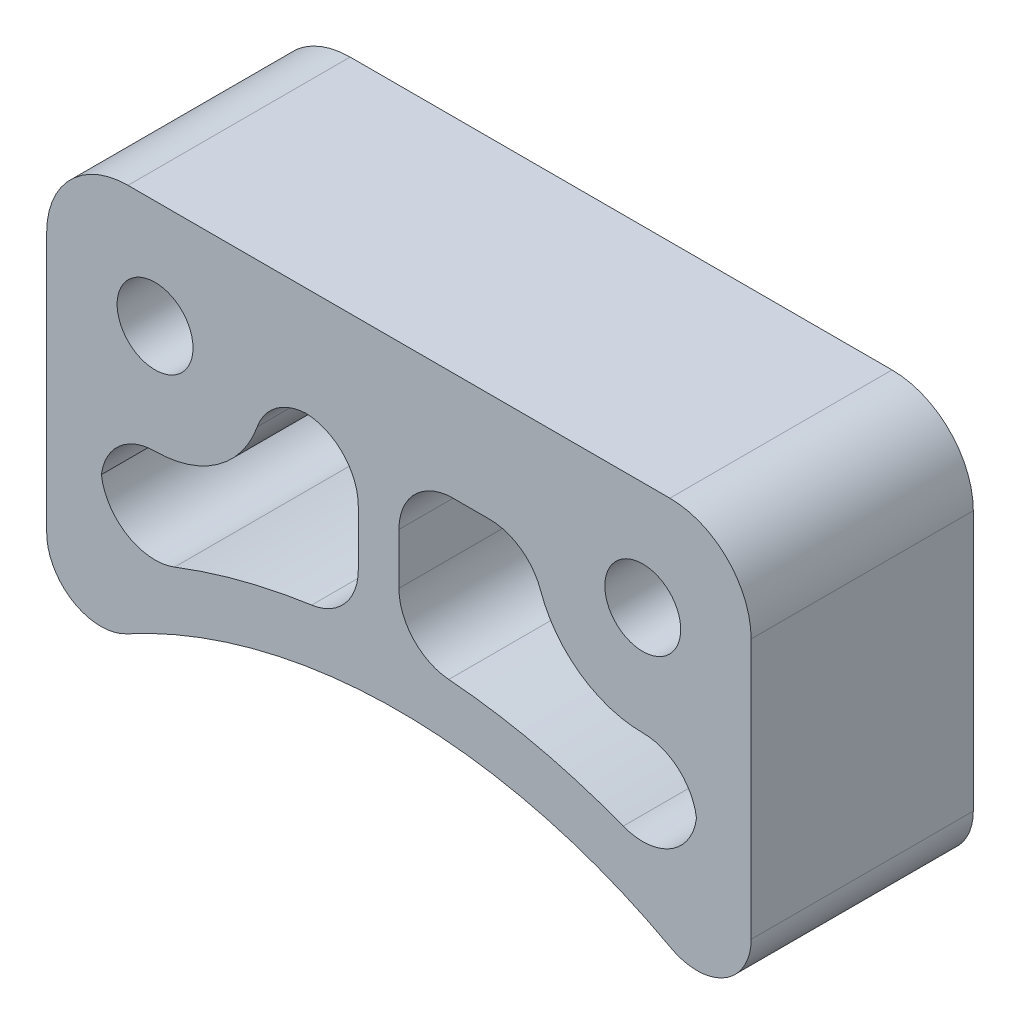
ISO-10303-21;
HEADER;
FILE_DESCRIPTION(('STEP AP214'),'2;1');
FILE_NAME('part.step','',(''),(''),'','','');
FILE_SCHEMA(('AUTOMOTIVE_DESIGN { 1 0 10303 214 1 1 1 1 }'));
ENDSEC;
DATA;
#1=APPLICATION_CONTEXT('core data for automotive mechanical design processes');
#2=APPLICATION_PROTOCOL_DEFINITION('international standard','automotive_design',2000,#1);
#3=PRODUCT_CONTEXT('',#1,'mechanical');
#4=PRODUCT('Part','Part','',(#3));
#5=PRODUCT_RELATED_PRODUCT_CATEGORY('part','',(#4));
#6=PRODUCT_DEFINITION_FORMATION('','',#4);
#7=PRODUCT_DEFINITION_CONTEXT('part definition',#1,'design');
#8=PRODUCT_DEFINITION('design','',#6,#7);
#9=PRODUCT_DEFINITION_SHAPE('','',#8);
#10=(LENGTH_UNIT() NAMED_UNIT(*) SI_UNIT(.MILLI.,.METRE.));
#11=(NAMED_UNIT(*) PLANE_ANGLE_UNIT() SI_UNIT($,.RADIAN.));
#12=(NAMED_UNIT(*) SI_UNIT($,.STERADIAN.) SOLID_ANGLE_UNIT());
#13=UNCERTAINTY_MEASURE_WITH_UNIT(LENGTH_MEASURE(1.E-05),#10,'distance_accuracy_value','');
#14=(GEOMETRIC_REPRESENTATION_CONTEXT(3) GLOBAL_UNCERTAINTY_ASSIGNED_CONTEXT((#13)) GLOBAL_UNIT_ASSIGNED_CONTEXT((#10,
#11,#12)) REPRESENTATION_CONTEXT('',''));
#15=CARTESIAN_POINT('',(0.,0.,0.));
#16=DIRECTION('',(0.,0.,1.));
#17=DIRECTION('',(1.,0.,0.));
#18=AXIS2_PLACEMENT_3D('',#15,#16,#17);
#19=CARTESIAN_POINT('',(1.07552855510562E-12,-28.8000000000008,-1.8));
#20=DIRECTION('',(0.,0.,1.));
#21=DIRECTION('',(1.,0.,0.));
#22=AXIS2_PLACEMENT_3D('',#19,#20,#21);
#23=CYLINDRICAL_SURFACE('',#22,22.9999999999993);
#24=CARTESIAN_POINT('',(1.07552855510562E-12,-28.8000000000008,0.));
#25=DIRECTION('',(0.,0.,1.));
#26=DIRECTION('',(1.,0.,0.));
#27=AXIS2_PLACEMENT_3D('',#24,#25,#26);
#28=CIRCLE('',#27,22.9999999999993);
#29=CARTESIAN_POINT('',(8.28000000000007,-7.34209702697041,0.));
#30=VERTEX_POINT('',#29);
#31=CARTESIAN_POINT('',(1.84000000000016,-5.8737181383475,0.));
#32=VERTEX_POINT('',#31);
#33=EDGE_CURVE('E275',#30,#32,#28,.T.);
#34=ORIENTED_EDGE('',*,*,#33,.T.);
#35=DIRECTION('',(0.,0.,1.));
#36=VECTOR('',#35,1.);
#37=CARTESIAN_POINT('',(1.84000000000016,-5.8737181383475,-1.8));
#38=LINE('',#37,#36);
#39=CARTESIAN_POINT('',(1.84000000000016,-5.8737181383475,8.2));
#40=VERTEX_POINT('',#39);
#41=EDGE_CURVE('E291',#32,#40,#38,.T.);
#42=ORIENTED_EDGE('',*,*,#41,.T.);
#43=CARTESIAN_POINT('',(1.07552855510562E-12,-28.8000000000008,8.2));
#44=DIRECTION('',(0.,0.,1.));
#45=DIRECTION('',(1.,0.,0.));
#46=AXIS2_PLACEMENT_3D('',#43,#44,#45);
#47=CIRCLE('',#46,22.9999999999993);
#48=CARTESIAN_POINT('',(8.28000000000007,-7.34209702697041,8.2));
#49=VERTEX_POINT('',#48);
#50=EDGE_CURVE('E382',#49,#40,#47,.T.);
#51=ORIENTED_EDGE('',*,*,#50,.F.);
#52=DIRECTION('',(0.,0.,1.));
#53=VECTOR('',#52,1.);
#54=CARTESIAN_POINT('',(8.28000000000007,-7.3420970269704,-1.8));
#55=LINE('',#54,#53);
#56=EDGE_CURVE('E289',#49,#30,#55,.F.);
#57=ORIENTED_EDGE('',*,*,#56,.T.);
#58=EDGE_LOOP('',(#34,#42,#51,#57));
#59=FACE_BOUND('',#58,.T.);
#60=ADVANCED_FACE('F39',(#59),#23,.T.);
#61=CARTESIAN_POINT('',(0.,0.,-1.8));
#62=DIRECTION('',(0.,-1.,0.));
#63=DIRECTION('',(0.,0.,-1.));
#64=AXIS2_PLACEMENT_3D('',#61,#62,#63);
#65=PLANE('',#64);
#66=DIRECTION('',(1.,0.,0.));
#67=VECTOR('',#66,1.);
#68=CARTESIAN_POINT('',(0.,0.,8.2));
#69=LINE('',#68,#67);
#70=CARTESIAN_POINT('',(2.00000000000004,0.,8.2));
#71=VERTEX_POINT('',#70);
#72=CARTESIAN_POINT('',(3.34314575050762,0.,8.2));
#73=VERTEX_POINT('',#72);
#74=EDGE_CURVE('E388',#71,#73,#69,.T.);
#75=ORIENTED_EDGE('',*,*,#74,.F.);
#76=DIRECTION('',(0.,0.,1.));
#77=VECTOR('',#76,1.);
#78=CARTESIAN_POINT('',(2.00000000000004,0.,-1.8));
#79=LINE('',#78,#77);
#80=CARTESIAN_POINT('',(2.00000000000004,0.,0.));
#81=VERTEX_POINT('',#80);
#82=EDGE_CURVE('E302',#71,#81,#79,.F.);
#83=ORIENTED_EDGE('',*,*,#82,.T.);
#84=DIRECTION('',(1.,0.,0.));
#85=VECTOR('',#84,1.);
#86=CARTESIAN_POINT('',(1.07552855510562E-12,0.,0.));
#87=LINE('',#86,#85);
#88=CARTESIAN_POINT('',(3.34314575050762,0.,0.));
#89=VERTEX_POINT('',#88);
#90=EDGE_CURVE('E268',#81,#89,#87,.T.);
#91=ORIENTED_EDGE('',*,*,#90,.T.);
#92=DIRECTION('',(0.,0.,-1.));
#93=VECTOR('',#92,1.);
#94=CARTESIAN_POINT('',(3.34314575050762,0.,8.2));
#95=LINE('',#94,#93);
#96=EDGE_CURVE('E299',#89,#73,#95,.F.);
#97=ORIENTED_EDGE('',*,*,#96,.T.);
#98=EDGE_LOOP('',(#75,#83,#91,#97));
#99=FACE_BOUND('',#98,.T.);
#100=ADVANCED_FACE('F448',(#99),#65,.T.);
#101=CARTESIAN_POINT('',(1.07552855510562E-12,-28.8000000000008,8.2));
#102=DIRECTION('',(0.,0.,1.));
#103=DIRECTION('',(1.,0.,0.));
#104=AXIS2_PLACEMENT_3D('',#101,#102,#103);
#105=PLANE('',#104);
#106=CARTESIAN_POINT('',(-9.,0.,8.2));
#107=DIRECTION('',(0.,0.,1.));
#108=DIRECTION('',(1.,0.,0.));
#109=AXIS2_PLACEMENT_3D('',#106,#107,#108);
#110=CIRCLE('',#109,4.);
#111=CARTESIAN_POINT('',(-9.,-4.,8.2));
#112=VERTEX_POINT('',#111);
#113=CARTESIAN_POINT('',(-5.22876383367174,-1.33333333333333,8.2));
#114=VERTEX_POINT('',#113);
#115=EDGE_CURVE('E397',#112,#114,#110,.T.);
#116=ORIENTED_EDGE('',*,*,#115,.T.);
#117=CARTESIAN_POINT('',(-3.34314575050762,-2.,8.2));
#118=DIRECTION('',(0.,0.,1.));
#119=DIRECTION('',(1.,0.,0.));
#120=AXIS2_PLACEMENT_3D('',#117,#118,#119);
#121=CIRCLE('',#120,2.);
#122=CARTESIAN_POINT('',(-3.42157287525381,-0.00153829506191298,8.2));
#123=VERTEX_POINT('',#122);
#124=EDGE_CURVE('E353',#114,#123,#121,.F.);
#125=ORIENTED_EDGE('',*,*,#124,.T.);
#126=CARTESIAN_POINT('',(-3.5,-2.,8.2));
#127=DIRECTION('',(0.,0.,1.));
#128=DIRECTION('',(1.,0.,0.));
#129=AXIS2_PLACEMENT_3D('',#126,#127,#128);
#130=CIRCLE('',#129,2.);
#131=CARTESIAN_POINT('',(-1.5,-2.,8.2));
#132=VERTEX_POINT('',#131);
#133=EDGE_CURVE('E329',#123,#132,#130,.F.);
#134=ORIENTED_EDGE('',*,*,#133,.T.);
#135=DIRECTION('',(0.,-1.,0.));
#136=VECTOR('',#135,1.);
#137=CARTESIAN_POINT('',(-1.5,0.,8.2));
#138=LINE('',#137,#136);
#139=CARTESIAN_POINT('',(-1.5,-4.04621241102849,8.2));
#140=VERTEX_POINT('',#139);
#141=EDGE_CURVE('E366',#132,#140,#138,.T.);
#142=ORIENTED_EDGE('',*,*,#141,.T.);
#143=CARTESIAN_POINT('',(-3.5,-4.04621241102849,8.2));
#144=DIRECTION('',(0.,0.,1.));
#145=DIRECTION('',(1.,0.,0.));
#146=AXIS2_PLACEMENT_3D('',#143,#144,#145);
#147=CIRCLE('',#146,2.);
#148=CARTESIAN_POINT('',(-3.21999999999991,-6.02651541814632,8.2));
#149=VERTEX_POINT('',#148);
#150=EDGE_CURVE('E333',#140,#149,#147,.F.);
#151=ORIENTED_EDGE('',*,*,#150,.T.);
#152=CARTESIAN_POINT('',(-8.27999999999989,-7.34209702697117,8.2));
#153=VERTEX_POINT('',#152);
#154=EDGE_CURVE('E386',#149,#153,#47,.T.);
#155=ORIENTED_EDGE('',*,*,#154,.T.);
#156=CARTESIAN_POINT('',(-9.,-5.47619242062071,8.2));
#157=DIRECTION('',(0.,0.,1.));
#158=DIRECTION('',(1.,0.,0.));
#159=AXIS2_PLACEMENT_3D('',#156,#157,#158);
#160=CIRCLE('',#159,2.);
#161=CARTESIAN_POINT('',(-10.9827774471549,-5.73809621031036,8.2));
#162=VERTEX_POINT('',#161);
#163=EDGE_CURVE('E345',#153,#162,#160,.F.);
#164=ORIENTED_EDGE('',*,*,#163,.T.);
#165=CARTESIAN_POINT('',(-9.,-6.,8.2));
#166=DIRECTION('',(0.,0.,1.));
#167=DIRECTION('',(1.,0.,0.));
#168=AXIS2_PLACEMENT_3D('',#165,#166,#167);
#169=CIRCLE('',#168,2.);
#170=EDGE_CURVE('E349',#162,#112,#169,.F.);
#171=ORIENTED_EDGE('',*,*,#170,.T.);
#172=EDGE_LOOP('',(#116,#125,#134,#142,#151,#155,#164,#171));
#173=FACE_BOUND('',#172,.T.);
#174=CARTESIAN_POINT('',(-9.,0.,8.2));
#175=DIRECTION('',(0.,0.,1.));
#176=DIRECTION('',(1.,0.,0.));
#177=AXIS2_PLACEMENT_3D('',#174,#175,#176);
#178=CIRCLE('',#177,1.4);
#179=CARTESIAN_POINT('',(-7.6,0.,8.2));
#180=VERTEX_POINT('',#179);
#181=EDGE_CURVE('E249',#180,#180,#178,.T.);
#182=ORIENTED_EDGE('',*,*,#181,.F.);
#183=EDGE_LOOP('',(#182));
#184=FACE_BOUND('',#183,.T.);
#185=CARTESIAN_POINT('',(1.07552855510562E-12,-28.8000000000008,8.2));
#186=DIRECTION('',(0.,0.,-1.));
#187=DIRECTION('',(1.,0.,0.));
#188=AXIS2_PLACEMENT_3D('',#185,#186,#187);
#189=CIRCLE('',#188,20.9999999999993);
#190=CARTESIAN_POINT('',(-10.0434782608694,-10.3574257647322,8.2));
#191=VERTEX_POINT('',#190);
#192=CARTESIAN_POINT('',(10.0434782608696,-10.3574257647311,8.2));
#193=VERTEX_POINT('',#192);
#194=EDGE_CURVE('E220',#191,#193,#189,.T.);
#195=ORIENTED_EDGE('',*,*,#194,.T.);
#196=CARTESIAN_POINT('',(11.,-8.60099012327681,8.2));
#197=DIRECTION('',(0.,0.,1.));
#198=DIRECTION('',(1.,0.,0.));
#199=AXIS2_PLACEMENT_3D('',#196,#197,#198);
#200=CIRCLE('',#199,2.);
#201=CARTESIAN_POINT('',(13.,-8.60099012327681,8.2));
#202=VERTEX_POINT('',#201);
#203=EDGE_CURVE('E216',#193,#202,#200,.T.);
#204=ORIENTED_EDGE('',*,*,#203,.T.);
#205=DIRECTION('',(0.,1.,0.));
#206=VECTOR('',#205,1.);
#207=CARTESIAN_POINT('',(13.,0.999999999999977,8.2));
#208=LINE('',#207,#206);
#209=CARTESIAN_POINT('',(13.,0.999999999999977,8.2));
#210=VERTEX_POINT('',#209);
#211=EDGE_CURVE('E207',#202,#210,#208,.T.);
#212=ORIENTED_EDGE('',*,*,#211,.T.);
#213=CARTESIAN_POINT('',(10.,0.999999999999999,8.2));
#214=DIRECTION('',(0.,0.,1.));
#215=DIRECTION('',(1.,0.,0.));
#216=AXIS2_PLACEMENT_3D('',#213,#214,#215);
#217=CIRCLE('',#216,3.);
#218=CARTESIAN_POINT('',(9.99999999999998,4.,8.2));
#219=VERTEX_POINT('',#218);
#220=EDGE_CURVE('E213',#210,#219,#217,.T.);
#221=ORIENTED_EDGE('',*,*,#220,.T.);
#222=DIRECTION('',(-1.,0.,0.));
#223=VECTOR('',#222,1.);
#224=CARTESIAN_POINT('',(-9.99999999999998,4.,8.2));
#225=LINE('',#224,#223);
#226=CARTESIAN_POINT('',(-9.99999999999998,4.,8.2));
#227=VERTEX_POINT('',#226);
#228=EDGE_CURVE('E235',#219,#227,#225,.T.);
#229=ORIENTED_EDGE('',*,*,#228,.T.);
#230=CARTESIAN_POINT('',(-10.,0.999999999999999,8.2));
#231=DIRECTION('',(0.,0.,1.));
#232=DIRECTION('',(1.,0.,0.));
#233=AXIS2_PLACEMENT_3D('',#230,#231,#232);
#234=CIRCLE('',#233,3.);
#235=CARTESIAN_POINT('',(-13.,0.999999999999978,8.2));
#236=VERTEX_POINT('',#235);
#237=EDGE_CURVE('E237',#227,#236,#234,.T.);
#238=ORIENTED_EDGE('',*,*,#237,.T.);
#239=DIRECTION('',(0.,-1.,0.));
#240=VECTOR('',#239,1.);
#241=CARTESIAN_POINT('',(-13.,0.999999999999977,8.2));
#242=LINE('',#241,#240);
#243=CARTESIAN_POINT('',(-13.,-8.60099012327798,8.2));
#244=VERTEX_POINT('',#243);
#245=EDGE_CURVE('E242',#236,#244,#242,.T.);
#246=ORIENTED_EDGE('',*,*,#245,.T.);
#247=CARTESIAN_POINT('',(-11.,-8.60099012327798,8.2));
#248=DIRECTION('',(0.,0.,1.));
#249=DIRECTION('',(1.,0.,0.));
#250=AXIS2_PLACEMENT_3D('',#247,#248,#249);
#251=CIRCLE('',#250,2.);
#252=EDGE_CURVE('E324',#244,#191,#251,.T.);
#253=ORIENTED_EDGE('',*,*,#252,.T.);
#254=EDGE_LOOP('',(#195,#204,#212,#221,#229,#238,#246,#253));
#255=FACE_BOUND('',#254,.T.);
#256=CARTESIAN_POINT('',(9.,0.,8.2));
#257=DIRECTION('',(0.,0.,1.));
#258=DIRECTION('',(-1.,0.,0.));
#259=AXIS2_PLACEMENT_3D('',#256,#257,#258);
#260=CIRCLE('',#259,1.4);
#261=CARTESIAN_POINT('',(7.6,0.,8.2));
#262=VERTEX_POINT('',#261);
#263=EDGE_CURVE('E401',#262,#262,#260,.T.);
#264=ORIENTED_EDGE('',*,*,#263,.F.);
#265=EDGE_LOOP('',(#264));
#266=FACE_BOUND('',#265,.T.);
#267=CARTESIAN_POINT('',(9.,-6.,8.2));
#268=DIRECTION('',(0.,0.,1.));
#269=DIRECTION('',(1.,0.,0.));
#270=AXIS2_PLACEMENT_3D('',#267,#268,#269);
#271=CIRCLE('',#270,2.);
#272=CARTESIAN_POINT('',(9.,-4.,8.2));
#273=VERTEX_POINT('',#272);
#274=CARTESIAN_POINT('',(10.9827774471549,-5.73809621030994,8.2));
#275=VERTEX_POINT('',#274);
#276=EDGE_CURVE('E64',#273,#275,#271,.F.);
#277=ORIENTED_EDGE('',*,*,#276,.T.);
#278=CARTESIAN_POINT('',(9.,-5.47619242061988,8.2));
#279=DIRECTION('',(0.,0.,1.));
#280=DIRECTION('',(1.,0.,0.));
#281=AXIS2_PLACEMENT_3D('',#278,#279,#280);
#282=CIRCLE('',#281,2.);
#283=EDGE_CURVE('E360',#275,#49,#282,.F.);
#284=ORIENTED_EDGE('',*,*,#283,.T.);
#285=ORIENTED_EDGE('',*,*,#50,.T.);
#286=CARTESIAN_POINT('',(2.00000000000008,-3.88012841124715,8.2));
#287=DIRECTION('',(0.,0.,1.));
#288=DIRECTION('',(1.,0.,0.));
#289=AXIS2_PLACEMENT_3D('',#286,#287,#288);
#290=CIRCLE('',#289,2.);
#291=CARTESIAN_POINT('',(0.,-3.88012841124719,8.2));
#292=VERTEX_POINT('',#291);
#293=EDGE_CURVE('E337',#40,#292,#290,.F.);
#294=ORIENTED_EDGE('',*,*,#293,.T.);
#295=DIRECTION('',(0.,-1.,0.));
#296=VECTOR('',#295,1.);
#297=CARTESIAN_POINT('',(0.,0.,8.2));
#298=LINE('',#297,#296);
#299=CARTESIAN_POINT('',(0.,-2.00000000000004,8.2));
#300=VERTEX_POINT('',#299);
#301=EDGE_CURVE('E490',#300,#292,#298,.T.);
#302=ORIENTED_EDGE('',*,*,#301,.F.);
#303=CARTESIAN_POINT('',(2.00000000000004,-2.,8.2));
#304=DIRECTION('',(0.,0.,1.));
#305=DIRECTION('',(1.,0.,0.));
#306=AXIS2_PLACEMENT_3D('',#303,#304,#305);
#307=CIRCLE('',#306,2.);
#308=EDGE_CURVE('E341',#300,#71,#307,.F.);
#309=ORIENTED_EDGE('',*,*,#308,.T.);
#310=ORIENTED_EDGE('',*,*,#74,.T.);
#311=CARTESIAN_POINT('',(3.34314575050762,-2.,8.2));
#312=DIRECTION('',(0.,0.,1.));
#313=DIRECTION('',(1.,0.,0.));
#314=AXIS2_PLACEMENT_3D('',#311,#312,#313);
#315=CIRCLE('',#314,2.);
#316=CARTESIAN_POINT('',(5.22876383367174,-1.33333333333333,8.2));
#317=VERTEX_POINT('',#316);
#318=EDGE_CURVE('E48',#73,#317,#315,.F.);
#319=ORIENTED_EDGE('',*,*,#318,.T.);
#320=CARTESIAN_POINT('',(9.,0.,8.2));
#321=DIRECTION('',(0.,0.,1.));
#322=DIRECTION('',(1.,0.,0.));
#323=AXIS2_PLACEMENT_3D('',#320,#321,#322);
#324=CIRCLE('',#323,4.);
#325=EDGE_CURVE('E385',#317,#273,#324,.T.);
#326=ORIENTED_EDGE('',*,*,#325,.T.);
#327=EDGE_LOOP('',(#277,#284,#285,#294,#302,#309,#310,#319,#326));
#328=FACE_BOUND('',#327,.T.);
#329=ADVANCED_FACE('F210',(#173,#184,#255,#266,#328),#105,.T.);
#330=CARTESIAN_POINT('',(1.07552855510562E-12,-28.8000000000008,0.));
#331=DIRECTION('',(0.,0.,1.));
#332=DIRECTION('',(1.,0.,0.));
#333=AXIS2_PLACEMENT_3D('',#330,#331,#332);
#334=PLANE('',#333);
#335=DIRECTION('',(0.,1.,0.));
#336=VECTOR('',#335,1.);
#337=CARTESIAN_POINT('',(0.,0.,0.));
#338=LINE('',#337,#336);
#339=CARTESIAN_POINT('',(0.,-3.88012841124719,0.));
#340=VERTEX_POINT('',#339);
#341=CARTESIAN_POINT('',(0.,-2.00000000000004,0.));
#342=VERTEX_POINT('',#341);
#343=EDGE_CURVE('E488',#340,#342,#338,.T.);
#344=ORIENTED_EDGE('',*,*,#343,.F.);
#345=CARTESIAN_POINT('',(2.00000000000008,-3.88012841124715,0.));
#346=DIRECTION('',(0.,0.,1.));
#347=DIRECTION('',(1.,0.,0.));
#348=AXIS2_PLACEMENT_3D('',#345,#346,#347);
#349=CIRCLE('',#348,2.);
#350=EDGE_CURVE('E339',#340,#32,#349,.T.);
#351=ORIENTED_EDGE('',*,*,#350,.T.);
#352=ORIENTED_EDGE('',*,*,#33,.F.);
#353=CARTESIAN_POINT('',(9.,-5.47619242061988,0.));
#354=DIRECTION('',(0.,0.,1.));
#355=DIRECTION('',(1.,0.,0.));
#356=AXIS2_PLACEMENT_3D('',#353,#354,#355);
#357=CIRCLE('',#356,2.);
#358=CARTESIAN_POINT('',(10.9827774471549,-5.73809621030994,0.));
#359=VERTEX_POINT('',#358);
#360=EDGE_CURVE('E56',#30,#359,#357,.T.);
#361=ORIENTED_EDGE('',*,*,#360,.T.);
#362=CARTESIAN_POINT('',(9.,-6.,0.));
#363=DIRECTION('',(0.,0.,1.));
#364=DIRECTION('',(1.,0.,0.));
#365=AXIS2_PLACEMENT_3D('',#362,#363,#364);
#366=CIRCLE('',#365,2.);
#367=CARTESIAN_POINT('',(9.,-4.,0.));
#368=VERTEX_POINT('',#367);
#369=EDGE_CURVE('E358',#359,#368,#366,.T.);
#370=ORIENTED_EDGE('',*,*,#369,.T.);
#371=CARTESIAN_POINT('',(9.,0.,0.));
#372=DIRECTION('',(0.,0.,1.));
#373=DIRECTION('',(1.,0.,0.));
#374=AXIS2_PLACEMENT_3D('',#371,#372,#373);
#375=CIRCLE('',#374,4.);
#376=CARTESIAN_POINT('',(5.22876383367174,-1.33333333333333,0.));
#377=VERTEX_POINT('',#376);
#378=EDGE_CURVE('E229',#377,#368,#375,.T.);
#379=ORIENTED_EDGE('',*,*,#378,.F.);
#380=CARTESIAN_POINT('',(3.34314575050762,-2.,0.));
#381=DIRECTION('',(0.,0.,1.));
#382=DIRECTION('',(1.,0.,0.));
#383=AXIS2_PLACEMENT_3D('',#380,#381,#382);
#384=CIRCLE('',#383,2.);
#385=EDGE_CURVE('E11',#377,#89,#384,.T.);
#386=ORIENTED_EDGE('',*,*,#385,.T.);
#387=ORIENTED_EDGE('',*,*,#90,.F.);
#388=CARTESIAN_POINT('',(2.00000000000004,-2.,0.));
#389=DIRECTION('',(0.,0.,1.));
#390=DIRECTION('',(1.,0.,0.));
#391=AXIS2_PLACEMENT_3D('',#388,#389,#390);
#392=CIRCLE('',#391,2.);
#393=EDGE_CURVE('E343',#81,#342,#392,.T.);
#394=ORIENTED_EDGE('',*,*,#393,.T.);
#395=EDGE_LOOP('',(#344,#351,#352,#361,#370,#379,#386,#387,#394));
#396=FACE_BOUND('',#395,.T.);
#397=CARTESIAN_POINT('',(9.,0.,0.));
#398=DIRECTION('',(0.,0.,1.));
#399=DIRECTION('',(-1.,0.,0.));
#400=AXIS2_PLACEMENT_3D('',#397,#398,#399);
#401=CIRCLE('',#400,1.4);
#402=CARTESIAN_POINT('',(7.6,0.,0.));
#403=VERTEX_POINT('',#402);
#404=EDGE_CURVE('E400',#403,#403,#401,.T.);
#405=ORIENTED_EDGE('',*,*,#404,.T.);
#406=EDGE_LOOP('',(#405));
#407=FACE_BOUND('',#406,.T.);
#408=CARTESIAN_POINT('',(-9.,0.,0.));
#409=DIRECTION('',(0.,0.,1.));
#410=DIRECTION('',(1.,0.,0.));
#411=AXIS2_PLACEMENT_3D('',#408,#409,#410);
#412=CIRCLE('',#411,1.4);
#413=CARTESIAN_POINT('',(-7.6,0.,0.));
#414=VERTEX_POINT('',#413);
#415=EDGE_CURVE('E404',#414,#414,#412,.T.);
#416=ORIENTED_EDGE('',*,*,#415,.T.);
#417=EDGE_LOOP('',(#416));
#418=FACE_BOUND('',#417,.T.);
#419=DIRECTION('',(0.,1.,0.));
#420=VECTOR('',#419,1.);
#421=CARTESIAN_POINT('',(13.,0.999999999999977,0.));
#422=LINE('',#421,#420);
#423=CARTESIAN_POINT('',(13.,-8.60099012327681,0.));
#424=VERTEX_POINT('',#423);
#425=CARTESIAN_POINT('',(13.,0.999999999999977,0.));
#426=VERTEX_POINT('',#425);
#427=EDGE_CURVE('E226',#424,#426,#422,.T.);
#428=ORIENTED_EDGE('',*,*,#427,.F.);
#429=CARTESIAN_POINT('',(11.,-8.60099012327681,0.));
#430=DIRECTION('',(0.,0.,1.));
#431=DIRECTION('',(1.,0.,0.));
#432=AXIS2_PLACEMENT_3D('',#429,#430,#431);
#433=CIRCLE('',#432,2.);
#434=CARTESIAN_POINT('',(10.0434782608696,-10.3574257647311,0.));
#435=VERTEX_POINT('',#434);
#436=EDGE_CURVE('E317',#424,#435,#433,.F.);
#437=ORIENTED_EDGE('',*,*,#436,.T.);
#438=CARTESIAN_POINT('',(1.07552855510562E-12,-28.8000000000008,0.));
#439=DIRECTION('',(0.,0.,-1.));
#440=DIRECTION('',(1.,0.,0.));
#441=AXIS2_PLACEMENT_3D('',#438,#439,#440);
#442=CIRCLE('',#441,20.9999999999993);
#443=CARTESIAN_POINT('',(-10.0434782608694,-10.3574257647322,0.));
#444=VERTEX_POINT('',#443);
#445=EDGE_CURVE('E246',#444,#435,#442,.T.);
#446=ORIENTED_EDGE('',*,*,#445,.F.);
#447=CARTESIAN_POINT('',(-11.,-8.60099012327798,0.));
#448=DIRECTION('',(0.,0.,1.));
#449=DIRECTION('',(1.,0.,0.));
#450=AXIS2_PLACEMENT_3D('',#447,#448,#449);
#451=CIRCLE('',#450,2.);
#452=CARTESIAN_POINT('',(-13.,-8.60099012327798,0.));
#453=VERTEX_POINT('',#452);
#454=EDGE_CURVE('E315',#444,#453,#451,.F.);
#455=ORIENTED_EDGE('',*,*,#454,.T.);
#456=DIRECTION('',(0.,-1.,0.));
#457=VECTOR('',#456,1.);
#458=CARTESIAN_POINT('',(-13.,0.999999999999977,0.));
#459=LINE('',#458,#457);
#460=CARTESIAN_POINT('',(-13.,0.999999999999978,0.));
#461=VERTEX_POINT('',#460);
#462=EDGE_CURVE('E257',#461,#453,#459,.T.);
#463=ORIENTED_EDGE('',*,*,#462,.F.);
#464=CARTESIAN_POINT('',(-10.,0.999999999999999,0.));
#465=DIRECTION('',(0.,0.,1.));
#466=DIRECTION('',(1.,0.,0.));
#467=AXIS2_PLACEMENT_3D('',#464,#465,#466);
#468=CIRCLE('',#467,3.);
#469=CARTESIAN_POINT('',(-9.99999999999998,4.,0.));
#470=VERTEX_POINT('',#469);
#471=EDGE_CURVE('E255',#470,#461,#468,.T.);
#472=ORIENTED_EDGE('',*,*,#471,.F.);
#473=DIRECTION('',(-1.,0.,0.));
#474=VECTOR('',#473,1.);
#475=CARTESIAN_POINT('',(-9.99999999999998,4.,0.));
#476=LINE('',#475,#474);
#477=CARTESIAN_POINT('',(9.99999999999998,4.,0.));
#478=VERTEX_POINT('',#477);
#479=EDGE_CURVE('E253',#478,#470,#476,.T.);
#480=ORIENTED_EDGE('',*,*,#479,.F.);
#481=CARTESIAN_POINT('',(10.,0.999999999999999,0.));
#482=DIRECTION('',(0.,0.,1.));
#483=DIRECTION('',(1.,0.,0.));
#484=AXIS2_PLACEMENT_3D('',#481,#482,#483);
#485=CIRCLE('',#484,3.);
#486=EDGE_CURVE('E251',#426,#478,#485,.T.);
#487=ORIENTED_EDGE('',*,*,#486,.F.);
#488=EDGE_LOOP('',(#428,#437,#446,#455,#463,#472,#480,#487));
#489=FACE_BOUND('',#488,.T.);
#490=CARTESIAN_POINT('',(-3.21999999999991,-6.02651541814632,0.));
#491=VERTEX_POINT('',#490);
#492=CARTESIAN_POINT('',(-8.27999999999989,-7.34209702697117,0.));
#493=VERTEX_POINT('',#492);
#494=EDGE_CURVE('E274',#491,#493,#28,.T.);
#495=ORIENTED_EDGE('',*,*,#494,.F.);
#496=CARTESIAN_POINT('',(-3.5,-4.04621241102849,0.));
#497=DIRECTION('',(0.,0.,1.));
#498=DIRECTION('',(1.,0.,0.));
#499=AXIS2_PLACEMENT_3D('',#496,#497,#498);
#500=CIRCLE('',#499,2.);
#501=CARTESIAN_POINT('',(-1.5,-4.04621241102849,0.));
#502=VERTEX_POINT('',#501);
#503=EDGE_CURVE('E335',#491,#502,#500,.T.);
#504=ORIENTED_EDGE('',*,*,#503,.T.);
#505=DIRECTION('',(0.,1.,0.));
#506=VECTOR('',#505,1.);
#507=CARTESIAN_POINT('',(-1.5,0.,0.));
#508=LINE('',#507,#506);
#509=CARTESIAN_POINT('',(-1.5,-2.,0.));
#510=VERTEX_POINT('',#509);
#511=EDGE_CURVE('E391',#502,#510,#508,.T.);
#512=ORIENTED_EDGE('',*,*,#511,.T.);
#513=CARTESIAN_POINT('',(-3.5,-2.,0.));
#514=DIRECTION('',(0.,0.,1.));
#515=DIRECTION('',(1.,0.,0.));
#516=AXIS2_PLACEMENT_3D('',#513,#514,#515);
#517=CIRCLE('',#516,2.);
#518=CARTESIAN_POINT('',(-3.42157287525381,-0.00153829506191298,0.));
#519=VERTEX_POINT('',#518);
#520=EDGE_CURVE('E331',#510,#519,#517,.T.);
#521=ORIENTED_EDGE('',*,*,#520,.T.);
#522=CARTESIAN_POINT('',(-3.34314575050762,-2.,0.));
#523=DIRECTION('',(0.,0.,1.));
#524=DIRECTION('',(1.,0.,0.));
#525=AXIS2_PLACEMENT_3D('',#522,#523,#524);
#526=CIRCLE('',#525,2.);
#527=CARTESIAN_POINT('',(-5.22876383367174,-1.33333333333333,0.));
#528=VERTEX_POINT('',#527);
#529=EDGE_CURVE('E355',#519,#528,#526,.T.);
#530=ORIENTED_EDGE('',*,*,#529,.T.);
#531=CARTESIAN_POINT('',(-9.,0.,0.));
#532=DIRECTION('',(0.,0.,1.));
#533=DIRECTION('',(1.,0.,0.));
#534=AXIS2_PLACEMENT_3D('',#531,#532,#533);
#535=CIRCLE('',#534,4.);
#536=CARTESIAN_POINT('',(-9.,-4.,0.));
#537=VERTEX_POINT('',#536);
#538=EDGE_CURVE('E271',#537,#528,#535,.T.);
#539=ORIENTED_EDGE('',*,*,#538,.F.);
#540=CARTESIAN_POINT('',(-9.,-6.,0.));
#541=DIRECTION('',(0.,0.,1.));
#542=DIRECTION('',(1.,0.,0.));
#543=AXIS2_PLACEMENT_3D('',#540,#541,#542);
#544=CIRCLE('',#543,2.);
#545=CARTESIAN_POINT('',(-10.9827774471549,-5.73809621031036,0.));
#546=VERTEX_POINT('',#545);
#547=EDGE_CURVE('E351',#537,#546,#544,.T.);
#548=ORIENTED_EDGE('',*,*,#547,.T.);
#549=CARTESIAN_POINT('',(-9.,-5.47619242062071,0.));
#550=DIRECTION('',(0.,0.,1.));
#551=DIRECTION('',(1.,0.,0.));
#552=AXIS2_PLACEMENT_3D('',#549,#550,#551);
#553=CIRCLE('',#552,2.);
#554=EDGE_CURVE('E347',#546,#493,#553,.T.);
#555=ORIENTED_EDGE('',*,*,#554,.T.);
#556=EDGE_LOOP('',(#495,#504,#512,#521,#530,#539,#548,#555));
#557=FACE_BOUND('',#556,.T.);
#558=ADVANCED_FACE('F418',(#396,#407,#418,#489,#557),#334,.F.);
#559=CARTESIAN_POINT('',(1.07552855510562E-12,-28.8000000000008,8.2));
#560=DIRECTION('',(0.,0.,-1.));
#561=DIRECTION('',(-1.,0.,0.));
#562=AXIS2_PLACEMENT_3D('',#559,#560,#561);
#563=CYLINDRICAL_SURFACE('',#562,20.9999999999993);
#564=ORIENTED_EDGE('',*,*,#445,.T.);
#565=DIRECTION('',(0.,0.,-1.));
#566=VECTOR('',#565,1.);
#567=CARTESIAN_POINT('',(10.0434782608696,-10.3574257647311,8.2));
#568=LINE('',#567,#566);
#569=EDGE_CURVE('E322',#435,#193,#568,.F.);
#570=ORIENTED_EDGE('',*,*,#569,.T.);
#571=ORIENTED_EDGE('',*,*,#194,.F.);
#572=DIRECTION('',(0.,0.,-1.));
#573=VECTOR('',#572,1.);
#574=CARTESIAN_POINT('',(-10.0434782608694,-10.3574257647322,8.2));
#575=LINE('',#574,#573);
#576=EDGE_CURVE('E319',#191,#444,#575,.T.);
#577=ORIENTED_EDGE('',*,*,#576,.T.);
#578=EDGE_LOOP('',(#564,#570,#571,#577));
#579=FACE_BOUND('',#578,.T.);
#580=ADVANCED_FACE('F437',(#579),#563,.F.);
#581=CARTESIAN_POINT('',(13.,0.999999999999977,8.2));
#582=DIRECTION('',(-1.,0.,0.));
#583=DIRECTION('',(0.,-1.,0.));
#584=AXIS2_PLACEMENT_3D('',#581,#582,#583);
#585=PLANE('',#584);
#586=ORIENTED_EDGE('',*,*,#211,.F.);
#587=DIRECTION('',(0.,0.,-1.));
#588=VECTOR('',#587,1.);
#589=CARTESIAN_POINT('',(13.,-8.60099012327681,8.2));
#590=LINE('',#589,#588);
#591=EDGE_CURVE('E313',#202,#424,#590,.T.);
#592=ORIENTED_EDGE('',*,*,#591,.T.);
#593=ORIENTED_EDGE('',*,*,#427,.T.);
#594=DIRECTION('',(0.,0.,-1.));
#595=VECTOR('',#594,1.);
#596=CARTESIAN_POINT('',(13.,0.999999999999977,8.2));
#597=LINE('',#596,#595);
#598=EDGE_CURVE('E223',#210,#426,#597,.T.);
#599=ORIENTED_EDGE('',*,*,#598,.F.);
#600=EDGE_LOOP('',(#586,#592,#593,#599));
#601=FACE_BOUND('',#600,.T.);
#602=ADVANCED_FACE('F224',(#601),#585,.F.);
#603=CARTESIAN_POINT('',(10.,0.999999999999999,8.2));
#604=DIRECTION('',(0.,0.,-1.));
#605=DIRECTION('',(-1.,0.,0.));
#606=AXIS2_PLACEMENT_3D('',#603,#604,#605);
#607=CYLINDRICAL_SURFACE('',#606,3.);
#608=ORIENTED_EDGE('',*,*,#486,.T.);
#609=DIRECTION('',(0.,0.,-1.));
#610=VECTOR('',#609,1.);
#611=CARTESIAN_POINT('',(9.99999999999998,4.,8.2));
#612=LINE('',#611,#610);
#613=EDGE_CURVE('E230',#219,#478,#612,.T.);
#614=ORIENTED_EDGE('',*,*,#613,.F.);
#615=ORIENTED_EDGE('',*,*,#220,.F.);
#616=ORIENTED_EDGE('',*,*,#598,.T.);
#617=EDGE_LOOP('',(#608,#614,#615,#616));
#618=FACE_BOUND('',#617,.T.);
#619=ADVANCED_FACE('F232',(#618),#607,.T.);
#620=CARTESIAN_POINT('',(-9.99999999999998,4.,8.2));
#621=DIRECTION('',(0.,-1.,0.));
#622=DIRECTION('',(0.,0.,-1.));
#623=AXIS2_PLACEMENT_3D('',#620,#621,#622);
#624=PLANE('',#623);
#625=ORIENTED_EDGE('',*,*,#479,.T.);
#626=DIRECTION('',(0.,0.,-1.));
#627=VECTOR('',#626,1.);
#628=CARTESIAN_POINT('',(-9.99999999999998,4.,8.2));
#629=LINE('',#628,#627);
#630=EDGE_CURVE('E262',#227,#470,#629,.T.);
#631=ORIENTED_EDGE('',*,*,#630,.F.);
#632=ORIENTED_EDGE('',*,*,#228,.F.);
#633=ORIENTED_EDGE('',*,*,#613,.T.);
#634=EDGE_LOOP('',(#625,#631,#632,#633));
#635=FACE_BOUND('',#634,.T.);
#636=ADVANCED_FACE('F424',(#635),#624,.F.);
#637=CARTESIAN_POINT('',(-10.,0.999999999999999,8.2));
#638=DIRECTION('',(0.,0.,-1.));
#639=DIRECTION('',(-1.,0.,0.));
#640=AXIS2_PLACEMENT_3D('',#637,#638,#639);
#641=CYLINDRICAL_SURFACE('',#640,3.);
#642=ORIENTED_EDGE('',*,*,#471,.T.);
#643=DIRECTION('',(0.,0.,-1.));
#644=VECTOR('',#643,1.);
#645=CARTESIAN_POINT('',(-13.,0.999999999999978,8.2));
#646=LINE('',#645,#644);
#647=EDGE_CURVE('E245',#236,#461,#646,.T.);
#648=ORIENTED_EDGE('',*,*,#647,.F.);
#649=ORIENTED_EDGE('',*,*,#237,.F.);
#650=ORIENTED_EDGE('',*,*,#630,.T.);
#651=EDGE_LOOP('',(#642,#648,#649,#650));
#652=FACE_BOUND('',#651,.T.);
#653=ADVANCED_FACE('F430',(#652),#641,.T.);
#654=CARTESIAN_POINT('',(-13.,0.999999999999977,8.2));
#655=DIRECTION('',(1.,0.,0.));
#656=DIRECTION('',(0.,1.,0.));
#657=AXIS2_PLACEMENT_3D('',#654,#655,#656);
#658=PLANE('',#657);
#659=ORIENTED_EDGE('',*,*,#462,.T.);
#660=DIRECTION('',(0.,0.,-1.));
#661=VECTOR('',#660,1.);
#662=CARTESIAN_POINT('',(-13.,-8.60099012327798,8.2));
#663=LINE('',#662,#661);
#664=EDGE_CURVE('E327',#453,#244,#663,.F.);
#665=ORIENTED_EDGE('',*,*,#664,.T.);
#666=ORIENTED_EDGE('',*,*,#245,.F.);
#667=ORIENTED_EDGE('',*,*,#647,.T.);
#668=EDGE_LOOP('',(#659,#665,#666,#667));
#669=FACE_BOUND('',#668,.T.);
#670=ADVANCED_FACE('F433',(#669),#658,.F.);
#671=CARTESIAN_POINT('',(-9.,0.,8.2));
#672=DIRECTION('',(0.,0.,-1.));
#673=DIRECTION('',(-1.,0.,0.));
#674=AXIS2_PLACEMENT_3D('',#671,#672,#673);
#675=CYLINDRICAL_SURFACE('',#674,1.4);
#676=ORIENTED_EDGE('',*,*,#181,.T.);
#677=EDGE_LOOP('',(#676));
#678=FACE_BOUND('',#677,.T.);
#679=ORIENTED_EDGE('',*,*,#415,.F.);
#680=EDGE_LOOP('',(#679));
#681=FACE_BOUND('',#680,.T.);
#682=ADVANCED_FACE('F469',(#678,#681),#675,.F.);
#683=CARTESIAN_POINT('',(9.,0.,8.2));
#684=DIRECTION('',(0.,0.,-1.));
#685=DIRECTION('',(-1.,0.,0.));
#686=AXIS2_PLACEMENT_3D('',#683,#684,#685);
#687=CYLINDRICAL_SURFACE('',#686,1.4);
#688=ORIENTED_EDGE('',*,*,#263,.T.);
#689=EDGE_LOOP('',(#688));
#690=FACE_BOUND('',#689,.T.);
#691=ORIENTED_EDGE('',*,*,#404,.F.);
#692=EDGE_LOOP('',(#691));
#693=FACE_BOUND('',#692,.T.);
#694=ADVANCED_FACE('F460',(#690,#693),#687,.F.);
#695=ORIENTED_EDGE('',*,*,#154,.F.);
#696=DIRECTION('',(0.,0.,1.));
#697=VECTOR('',#696,1.);
#698=CARTESIAN_POINT('',(-3.21999999999991,-6.02651541814632,-1.8));
#699=LINE('',#698,#697);
#700=EDGE_CURVE('E287',#149,#491,#699,.F.);
#701=ORIENTED_EDGE('',*,*,#700,.T.);
#702=ORIENTED_EDGE('',*,*,#494,.T.);
#703=DIRECTION('',(0.,0.,1.));
#704=VECTOR('',#703,1.);
#705=CARTESIAN_POINT('',(-8.27999999999989,-7.34209702697117,-1.8));
#706=LINE('',#705,#704);
#707=EDGE_CURVE('E284',#493,#153,#706,.T.);
#708=ORIENTED_EDGE('',*,*,#707,.T.);
#709=EDGE_LOOP('',(#695,#701,#702,#708));
#710=FACE_BOUND('',#709,.T.);
#711=ADVANCED_FACE('F450',(#710),#23,.T.);
#712=CARTESIAN_POINT('',(-9.,0.,-1.8));
#713=DIRECTION('',(0.,0.,1.));
#714=DIRECTION('',(1.,0.,0.));
#715=AXIS2_PLACEMENT_3D('',#712,#713,#714);
#716=CYLINDRICAL_SURFACE('',#715,4.);
#717=ORIENTED_EDGE('',*,*,#115,.F.);
#718=DIRECTION('',(0.,0.,1.));
#719=VECTOR('',#718,1.);
#720=CARTESIAN_POINT('',(-9.,-4.,-1.8));
#721=LINE('',#720,#719);
#722=EDGE_CURVE('E306',#112,#537,#721,.F.);
#723=ORIENTED_EDGE('',*,*,#722,.T.);
#724=ORIENTED_EDGE('',*,*,#538,.T.);
#725=DIRECTION('',(0.,0.,1.));
#726=VECTOR('',#725,1.);
#727=CARTESIAN_POINT('',(-5.22876383367174,-1.33333333333333,-1.8));
#728=LINE('',#727,#726);
#729=EDGE_CURVE('E304',#528,#114,#728,.T.);
#730=ORIENTED_EDGE('',*,*,#729,.T.);
#731=EDGE_LOOP('',(#717,#723,#724,#730));
#732=FACE_BOUND('',#731,.T.);
#733=ADVANCED_FACE('F459',(#732),#716,.T.);
#734=CARTESIAN_POINT('',(9.,0.,-1.8));
#735=DIRECTION('',(0.,0.,1.));
#736=DIRECTION('',(1.,0.,0.));
#737=AXIS2_PLACEMENT_3D('',#734,#735,#736);
#738=CYLINDRICAL_SURFACE('',#737,4.);
#739=ORIENTED_EDGE('',*,*,#378,.T.);
#740=DIRECTION('',(0.,0.,1.));
#741=VECTOR('',#740,1.);
#742=CARTESIAN_POINT('',(9.,-4.,-1.8));
#743=LINE('',#742,#741);
#744=EDGE_CURVE('E310',#368,#273,#743,.T.);
#745=ORIENTED_EDGE('',*,*,#744,.T.);
#746=ORIENTED_EDGE('',*,*,#325,.F.);
#747=DIRECTION('',(0.,0.,1.));
#748=VECTOR('',#747,1.);
#749=CARTESIAN_POINT('',(5.22876383367174,-1.33333333333333,-1.8));
#750=LINE('',#749,#748);
#751=EDGE_CURVE('E308',#317,#377,#750,.F.);
#752=ORIENTED_EDGE('',*,*,#751,.T.);
#753=EDGE_LOOP('',(#739,#745,#746,#752));
#754=FACE_BOUND('',#753,.T.);
#755=ADVANCED_FACE('F466',(#754),#738,.T.);
#756=CARTESIAN_POINT('',(0.,0.,-6.03824423990407));
#757=DIRECTION('',(-1.,0.,0.));
#758=DIRECTION('',(0.,-1.,0.));
#759=AXIS2_PLACEMENT_3D('',#756,#757,#758);
#760=PLANE('',#759);
#761=ORIENTED_EDGE('',*,*,#301,.T.);
#762=DIRECTION('',(0.,0.,1.));
#763=VECTOR('',#762,1.);
#764=CARTESIAN_POINT('',(0.,-3.88012841124719,-6.03824423990407));
#765=LINE('',#764,#763);
#766=EDGE_CURVE('E297',#292,#340,#765,.F.);
#767=ORIENTED_EDGE('',*,*,#766,.T.);
#768=ORIENTED_EDGE('',*,*,#343,.T.);
#769=DIRECTION('',(0.,0.,1.));
#770=VECTOR('',#769,1.);
#771=CARTESIAN_POINT('',(0.,-2.00000000000004,-6.03824423990407));
#772=LINE('',#771,#770);
#773=EDGE_CURVE('E294',#342,#300,#772,.T.);
#774=ORIENTED_EDGE('',*,*,#773,.T.);
#775=EDGE_LOOP('',(#761,#767,#768,#774));
#776=FACE_BOUND('',#775,.T.);
#777=ADVANCED_FACE('F552',(#776),#760,.F.);
#778=CARTESIAN_POINT('',(-1.5,0.,-6.03824423990407));
#779=DIRECTION('',(-1.,0.,0.));
#780=DIRECTION('',(0.,-1.,0.));
#781=AXIS2_PLACEMENT_3D('',#778,#779,#780);
#782=PLANE('',#781);
#783=ORIENTED_EDGE('',*,*,#141,.F.);
#784=DIRECTION('',(0.,0.,1.));
#785=VECTOR('',#784,1.);
#786=CARTESIAN_POINT('',(-1.5,-2.,0.));
#787=LINE('',#786,#785);
#788=EDGE_CURVE('E281',#132,#510,#787,.F.);
#789=ORIENTED_EDGE('',*,*,#788,.T.);
#790=ORIENTED_EDGE('',*,*,#511,.F.);
#791=DIRECTION('',(0.,0.,-1.));
#792=VECTOR('',#791,1.);
#793=CARTESIAN_POINT('',(-1.5,-4.04621241102849,8.2));
#794=LINE('',#793,#792);
#795=EDGE_CURVE('E278',#502,#140,#794,.F.);
#796=ORIENTED_EDGE('',*,*,#795,.T.);
#797=EDGE_LOOP('',(#783,#789,#790,#796));
#798=FACE_BOUND('',#797,.T.);
#799=ADVANCED_FACE('F485',(#798),#782,.T.);
#800=CARTESIAN_POINT('',(-3.34314575050762,-2.,-1.8));
#801=DIRECTION('',(0.,0.,1.));
#802=DIRECTION('',(1.,0.,0.));
#803=AXIS2_PLACEMENT_3D('',#800,#801,#802);
#804=CYLINDRICAL_SURFACE('',#803,2.);
#805=ORIENTED_EDGE('',*,*,#729,.F.);
#806=ORIENTED_EDGE('',*,*,#529,.F.);
#807=DIRECTION('',(0.,0.,1.));
#808=VECTOR('',#807,1.);
#809=CARTESIAN_POINT('',(-3.42157287525381,-0.00153829506191298,4.1));
#810=LINE('',#809,#808);
#811=EDGE_CURVE('E364',#123,#519,#810,.F.);
#812=ORIENTED_EDGE('',*,*,#811,.F.);
#813=ORIENTED_EDGE('',*,*,#124,.F.);
#814=EDGE_LOOP('',(#805,#806,#812,#813));
#815=FACE_BOUND('',#814,.T.);
#816=ADVANCED_FACE('F506',(#815),#804,.F.);
#817=CARTESIAN_POINT('',(-3.5,-2.,-1.8));
#818=DIRECTION('',(0.,0.,-1.));
#819=DIRECTION('',(-1.,0.,0.));
#820=AXIS2_PLACEMENT_3D('',#817,#818,#819);
#821=CYLINDRICAL_SURFACE('',#820,2.);
#822=ORIENTED_EDGE('',*,*,#520,.F.);
#823=ORIENTED_EDGE('',*,*,#788,.F.);
#824=ORIENTED_EDGE('',*,*,#133,.F.);
#825=ORIENTED_EDGE('',*,*,#811,.T.);
#826=EDGE_LOOP('',(#822,#823,#824,#825));
#827=FACE_BOUND('',#826,.T.);
#828=ADVANCED_FACE('F500',(#827),#821,.F.);
#829=CARTESIAN_POINT('',(-3.5,-4.04621241102849,-1.8));
#830=DIRECTION('',(0.,0.,1.));
#831=DIRECTION('',(1.,0.,0.));
#832=AXIS2_PLACEMENT_3D('',#829,#830,#831);
#833=CYLINDRICAL_SURFACE('',#832,2.);
#834=ORIENTED_EDGE('',*,*,#503,.F.);
#835=ORIENTED_EDGE('',*,*,#700,.F.);
#836=ORIENTED_EDGE('',*,*,#150,.F.);
#837=ORIENTED_EDGE('',*,*,#795,.F.);
#838=EDGE_LOOP('',(#834,#835,#836,#837));
#839=FACE_BOUND('',#838,.T.);
#840=ADVANCED_FACE('F479',(#839),#833,.F.);
#841=CARTESIAN_POINT('',(2.00000000000008,-3.88012841124715,-1.8));
#842=DIRECTION('',(0.,0.,1.));
#843=DIRECTION('',(1.,0.,0.));
#844=AXIS2_PLACEMENT_3D('',#841,#842,#843);
#845=CYLINDRICAL_SURFACE('',#844,2.);
#846=ORIENTED_EDGE('',*,*,#350,.F.);
#847=ORIENTED_EDGE('',*,*,#766,.F.);
#848=ORIENTED_EDGE('',*,*,#293,.F.);
#849=ORIENTED_EDGE('',*,*,#41,.F.);
#850=EDGE_LOOP('',(#846,#847,#848,#849));
#851=FACE_BOUND('',#850,.T.);
#852=ADVANCED_FACE('F550',(#851),#845,.F.);
#853=CARTESIAN_POINT('',(2.00000000000004,-2.,-6.03824423990407));
#854=DIRECTION('',(0.,0.,1.));
#855=DIRECTION('',(1.,0.,0.));
#856=AXIS2_PLACEMENT_3D('',#853,#854,#855);
#857=CYLINDRICAL_SURFACE('',#856,2.);
#858=ORIENTED_EDGE('',*,*,#393,.F.);
#859=ORIENTED_EDGE('',*,*,#82,.F.);
#860=ORIENTED_EDGE('',*,*,#308,.F.);
#861=ORIENTED_EDGE('',*,*,#773,.F.);
#862=EDGE_LOOP('',(#858,#859,#860,#861));
#863=FACE_BOUND('',#862,.T.);
#864=ADVANCED_FACE('F522',(#863),#857,.F.);
#865=CARTESIAN_POINT('',(-9.,-6.,-1.8));
#866=DIRECTION('',(0.,0.,1.));
#867=DIRECTION('',(1.,0.,0.));
#868=AXIS2_PLACEMENT_3D('',#865,#866,#867);
#869=CYLINDRICAL_SURFACE('',#868,2.);
#870=DIRECTION('',(0.,0.,1.));
#871=VECTOR('',#870,1.);
#872=CARTESIAN_POINT('',(-10.9827774471549,-5.73809621031036,4.1));
#873=LINE('',#872,#871);
#874=EDGE_CURVE('E367',#546,#162,#873,.T.);
#875=ORIENTED_EDGE('',*,*,#874,.F.);
#876=ORIENTED_EDGE('',*,*,#547,.F.);
#877=ORIENTED_EDGE('',*,*,#722,.F.);
#878=ORIENTED_EDGE('',*,*,#170,.F.);
#879=EDGE_LOOP('',(#875,#876,#877,#878));
#880=FACE_BOUND('',#879,.T.);
#881=ADVANCED_FACE('F512',(#880),#869,.F.);
#882=CARTESIAN_POINT('',(-9.,-5.47619242062071,-1.8));
#883=DIRECTION('',(0.,0.,1.));
#884=DIRECTION('',(1.,0.,0.));
#885=AXIS2_PLACEMENT_3D('',#882,#883,#884);
#886=CYLINDRICAL_SURFACE('',#885,2.);
#887=ORIENTED_EDGE('',*,*,#554,.F.);
#888=ORIENTED_EDGE('',*,*,#874,.T.);
#889=ORIENTED_EDGE('',*,*,#163,.F.);
#890=ORIENTED_EDGE('',*,*,#707,.F.);
#891=EDGE_LOOP('',(#887,#888,#889,#890));
#892=FACE_BOUND('',#891,.T.);
#893=ADVANCED_FACE('F514',(#892),#886,.F.);
#894=CARTESIAN_POINT('',(9.,-5.47619242061988,-1.8));
#895=DIRECTION('',(0.,0.,1.));
#896=DIRECTION('',(1.,0.,0.));
#897=AXIS2_PLACEMENT_3D('',#894,#895,#896);
#898=CYLINDRICAL_SURFACE('',#897,2.);
#899=DIRECTION('',(0.,0.,1.));
#900=VECTOR('',#899,1.);
#901=CARTESIAN_POINT('',(10.9827774471549,-5.73809621030994,4.1));
#902=LINE('',#901,#900);
#903=EDGE_CURVE('E43',#359,#275,#902,.T.);
#904=ORIENTED_EDGE('',*,*,#903,.F.);
#905=ORIENTED_EDGE('',*,*,#360,.F.);
#906=ORIENTED_EDGE('',*,*,#56,.F.);
#907=ORIENTED_EDGE('',*,*,#283,.F.);
#908=EDGE_LOOP('',(#904,#905,#906,#907));
#909=FACE_BOUND('',#908,.T.);
#910=ADVANCED_FACE('F378',(#909),#898,.F.);
#911=CARTESIAN_POINT('',(9.,-6.,-1.8));
#912=DIRECTION('',(0.,0.,1.));
#913=DIRECTION('',(1.,0.,0.));
#914=AXIS2_PLACEMENT_3D('',#911,#912,#913);
#915=CYLINDRICAL_SURFACE('',#914,2.);
#916=ORIENTED_EDGE('',*,*,#369,.F.);
#917=ORIENTED_EDGE('',*,*,#903,.T.);
#918=ORIENTED_EDGE('',*,*,#276,.F.);
#919=ORIENTED_EDGE('',*,*,#744,.F.);
#920=EDGE_LOOP('',(#916,#917,#918,#919));
#921=FACE_BOUND('',#920,.T.);
#922=ADVANCED_FACE('F375',(#921),#915,.F.);
#923=CARTESIAN_POINT('',(11.,-8.60099012327681,8.2));
#924=DIRECTION('',(0.,0.,-1.));
#925=DIRECTION('',(-1.,0.,0.));
#926=AXIS2_PLACEMENT_3D('',#923,#924,#925);
#927=CYLINDRICAL_SURFACE('',#926,2.);
#928=ORIENTED_EDGE('',*,*,#203,.F.);
#929=ORIENTED_EDGE('',*,*,#569,.F.);
#930=ORIENTED_EDGE('',*,*,#436,.F.);
#931=ORIENTED_EDGE('',*,*,#591,.F.);
#932=EDGE_LOOP('',(#928,#929,#930,#931));
#933=FACE_BOUND('',#932,.T.);
#934=ADVANCED_FACE('F416',(#933),#927,.T.);
#935=CARTESIAN_POINT('',(-11.,-8.60099012327798,8.2));
#936=DIRECTION('',(0.,0.,-1.));
#937=DIRECTION('',(-1.,0.,0.));
#938=AXIS2_PLACEMENT_3D('',#935,#936,#937);
#939=CYLINDRICAL_SURFACE('',#938,2.);
#940=ORIENTED_EDGE('',*,*,#252,.F.);
#941=ORIENTED_EDGE('',*,*,#664,.F.);
#942=ORIENTED_EDGE('',*,*,#454,.F.);
#943=ORIENTED_EDGE('',*,*,#576,.F.);
#944=EDGE_LOOP('',(#940,#941,#942,#943));
#945=FACE_BOUND('',#944,.T.);
#946=ADVANCED_FACE('F436',(#945),#939,.T.);
#947=CARTESIAN_POINT('',(3.34314575050762,-2.,-1.8));
#948=DIRECTION('',(0.,0.,1.));
#949=DIRECTION('',(1.,0.,0.));
#950=AXIS2_PLACEMENT_3D('',#947,#948,#949);
#951=CYLINDRICAL_SURFACE('',#950,2.);
#952=ORIENTED_EDGE('',*,*,#385,.F.);
#953=ORIENTED_EDGE('',*,*,#751,.F.);
#954=ORIENTED_EDGE('',*,*,#318,.F.);
#955=ORIENTED_EDGE('',*,*,#96,.F.);
#956=EDGE_LOOP('',(#952,#953,#954,#955));
#957=FACE_BOUND('',#956,.T.);
#958=ADVANCED_FACE('F41',(#957),#951,.F.);
#959=CLOSED_SHELL('',(#60,#100,#329,#558,#580,#602,#619,#636,#653,#670,#682,#694,#711,#733,#755,
#777,#799,#816,#828,#840,#852,#864,#881,#893,#910,#922,#934,#946,#958));
#960=MANIFOLD_SOLID_BREP('B2',#959);
#961=ADVANCED_BREP_SHAPE_REPRESENTATION('',(#18,#960),#14);
#962=SHAPE_DEFINITION_REPRESENTATION(#9,#961);
ENDSEC;
END-ISO-10303-21;
